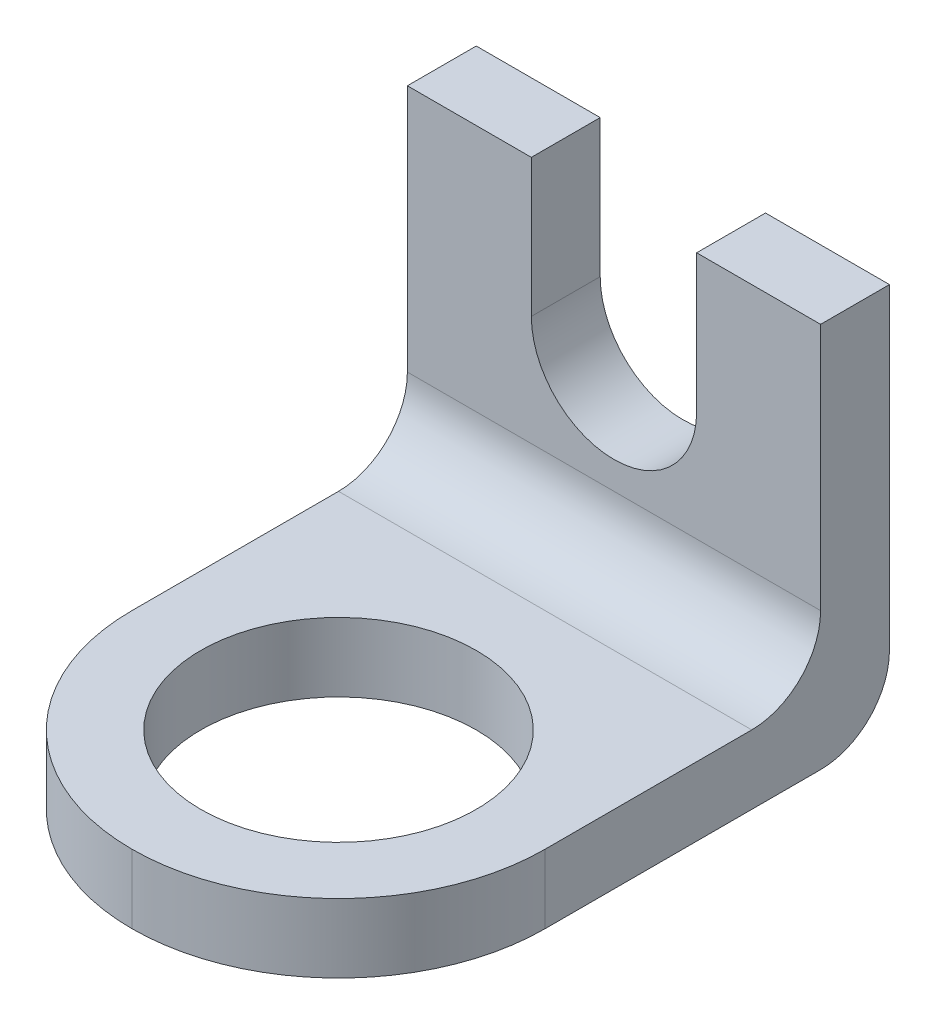
ISO-10303-21;
HEADER;
FILE_DESCRIPTION(('STEP AP214'),'2;1');
FILE_NAME('part.step','',(''),(''),'','','');
FILE_SCHEMA(('AUTOMOTIVE_DESIGN { 1 0 10303 214 1 1 1 1 }'));
ENDSEC;
DATA;
#1=APPLICATION_CONTEXT('core data for automotive mechanical design processes');
#2=APPLICATION_PROTOCOL_DEFINITION('international standard','automotive_design',2000,#1);
#3=PRODUCT_CONTEXT('',#1,'mechanical');
#4=PRODUCT('Part','Part','',(#3));
#5=PRODUCT_RELATED_PRODUCT_CATEGORY('part','',(#4));
#6=PRODUCT_DEFINITION_FORMATION('','',#4);
#7=PRODUCT_DEFINITION_CONTEXT('part definition',#1,'design');
#8=PRODUCT_DEFINITION('design','',#6,#7);
#9=PRODUCT_DEFINITION_SHAPE('','',#8);
#10=(LENGTH_UNIT() NAMED_UNIT(*) SI_UNIT(.MILLI.,.METRE.));
#11=(NAMED_UNIT(*) PLANE_ANGLE_UNIT() SI_UNIT($,.RADIAN.));
#12=(NAMED_UNIT(*) SI_UNIT($,.STERADIAN.) SOLID_ANGLE_UNIT());
#13=UNCERTAINTY_MEASURE_WITH_UNIT(LENGTH_MEASURE(1.E-05),#10,'distance_accuracy_value','');
#14=(GEOMETRIC_REPRESENTATION_CONTEXT(3) GLOBAL_UNCERTAINTY_ASSIGNED_CONTEXT((#13)) GLOBAL_UNIT_ASSIGNED_CONTEXT((#10,
#11,#12)) REPRESENTATION_CONTEXT('',''));
#15=CARTESIAN_POINT('',(0.,0.,0.));
#16=DIRECTION('',(0.,0.,1.));
#17=DIRECTION('',(1.,0.,0.));
#18=AXIS2_PLACEMENT_3D('',#15,#16,#17);
#19=CARTESIAN_POINT('',(0.,-14.,25.));
#20=DIRECTION('',(0.,1.,0.));
#21=DIRECTION('',(0.,0.,1.));
#22=AXIS2_PLACEMENT_3D('',#19,#20,#21);
#23=CYLINDRICAL_SURFACE('',#22,15.);
#24=DIRECTION('',(0.,1.,0.));
#25=VECTOR('',#24,1.);
#26=CARTESIAN_POINT('',(-15.,-14.,25.));
#27=LINE('',#26,#25);
#28=CARTESIAN_POINT('',(-15.,-14.,25.));
#29=VERTEX_POINT('',#28);
#30=CARTESIAN_POINT('',(-15.,-9.,25.));
#31=VERTEX_POINT('',#30);
#32=EDGE_CURVE('E249',#29,#31,#27,.T.);
#33=ORIENTED_EDGE('',*,*,#32,.F.);
#34=CARTESIAN_POINT('',(0.,-14.,25.));
#35=DIRECTION('',(0.,1.,0.));
#36=DIRECTION('',(0.,0.,1.));
#37=AXIS2_PLACEMENT_3D('',#34,#35,#36);
#38=CIRCLE('',#37,15.);
#39=CARTESIAN_POINT('',(0.,-14.,40.));
#40=VERTEX_POINT('',#39);
#41=EDGE_CURVE('E252',#40,#29,#38,.F.);
#42=ORIENTED_EDGE('',*,*,#41,.F.);
#43=DIRECTION('',(0.,-1.,0.));
#44=VECTOR('',#43,1.);
#45=CARTESIAN_POINT('',(0.,0.,40.));
#46=LINE('',#45,#44);
#47=CARTESIAN_POINT('',(0.,-9.,40.));
#48=VERTEX_POINT('',#47);
#49=EDGE_CURVE('E241',#40,#48,#46,.F.);
#50=ORIENTED_EDGE('',*,*,#49,.T.);
#51=CARTESIAN_POINT('',(0.,-9.,25.));
#52=DIRECTION('',(0.,-1.,0.));
#53=DIRECTION('',(0.,0.,-1.));
#54=AXIS2_PLACEMENT_3D('',#51,#52,#53);
#55=CIRCLE('',#54,15.);
#56=EDGE_CURVE('E254',#31,#48,#55,.F.);
#57=ORIENTED_EDGE('',*,*,#56,.F.);
#58=EDGE_LOOP('',(#33,#42,#50,#57));
#59=FACE_BOUND('',#58,.T.);
#60=ADVANCED_FACE('F41',(#59),#23,.T.);
#61=CARTESIAN_POINT('',(0.,-14.,25.));
#62=DIRECTION('',(0.,-1.,0.));
#63=DIRECTION('',(0.,0.,-1.));
#64=AXIS2_PLACEMENT_3D('',#61,#62,#63);
#65=CYLINDRICAL_SURFACE('',#64,15.);
#66=DIRECTION('',(0.,-1.,0.));
#67=VECTOR('',#66,1.);
#68=CARTESIAN_POINT('',(15.,-14.,25.));
#69=LINE('',#68,#67);
#70=CARTESIAN_POINT('',(15.,-9.,25.));
#71=VERTEX_POINT('',#70);
#72=CARTESIAN_POINT('',(15.,-14.,25.));
#73=VERTEX_POINT('',#72);
#74=EDGE_CURVE('E238',#71,#73,#69,.T.);
#75=ORIENTED_EDGE('',*,*,#74,.F.);
#76=CARTESIAN_POINT('',(0.,-9.,25.));
#77=DIRECTION('',(0.,-1.,0.));
#78=DIRECTION('',(0.,0.,-1.));
#79=AXIS2_PLACEMENT_3D('',#76,#77,#78);
#80=CIRCLE('',#79,15.);
#81=EDGE_CURVE('E244',#48,#71,#80,.F.);
#82=ORIENTED_EDGE('',*,*,#81,.F.);
#83=ORIENTED_EDGE('',*,*,#49,.F.);
#84=CARTESIAN_POINT('',(0.,-14.,25.));
#85=DIRECTION('',(0.,1.,0.));
#86=DIRECTION('',(0.,0.,1.));
#87=AXIS2_PLACEMENT_3D('',#84,#85,#86);
#88=CIRCLE('',#87,15.);
#89=EDGE_CURVE('E246',#73,#40,#88,.F.);
#90=ORIENTED_EDGE('',*,*,#89,.F.);
#91=EDGE_LOOP('',(#75,#82,#83,#90));
#92=FACE_BOUND('',#91,.T.);
#93=ADVANCED_FACE('F293',(#92),#65,.T.);
#94=CARTESIAN_POINT('',(-15.,-9.,5.));
#95=DIRECTION('',(-1.,0.,0.));
#96=DIRECTION('',(0.,0.,1.));
#97=AXIS2_PLACEMENT_3D('',#94,#95,#96);
#98=CYLINDRICAL_SURFACE('',#97,5.);
#99=DIRECTION('',(1.,0.,0.));
#100=VECTOR('',#99,1.);
#101=CARTESIAN_POINT('',(-15.,-14.,5.));
#102=LINE('',#101,#100);
#103=CARTESIAN_POINT('',(-15.,-14.,5.));
#104=VERTEX_POINT('',#103);
#105=CARTESIAN_POINT('',(15.,-14.,5.));
#106=VERTEX_POINT('',#105);
#107=EDGE_CURVE('E227',#104,#106,#102,.T.);
#108=ORIENTED_EDGE('',*,*,#107,.F.);
#109=CARTESIAN_POINT('',(-15.,-9.,5.));
#110=DIRECTION('',(1.,0.,0.));
#111=DIRECTION('',(0.,0.,-1.));
#112=AXIS2_PLACEMENT_3D('',#109,#110,#111);
#113=CIRCLE('',#112,5.);
#114=CARTESIAN_POINT('',(-15.,-9.,0.));
#115=VERTEX_POINT('',#114);
#116=EDGE_CURVE('E233',#115,#104,#113,.F.);
#117=ORIENTED_EDGE('',*,*,#116,.F.);
#118=DIRECTION('',(1.,0.,0.));
#119=VECTOR('',#118,1.);
#120=CARTESIAN_POINT('',(-15.,-9.,0.));
#121=LINE('',#120,#119);
#122=CARTESIAN_POINT('',(15.,-9.,0.));
#123=VERTEX_POINT('',#122);
#124=EDGE_CURVE('E230',#123,#115,#121,.F.);
#125=ORIENTED_EDGE('',*,*,#124,.F.);
#126=CARTESIAN_POINT('',(15.,-9.,5.));
#127=DIRECTION('',(-1.,0.,0.));
#128=DIRECTION('',(0.,0.,1.));
#129=AXIS2_PLACEMENT_3D('',#126,#127,#128);
#130=CIRCLE('',#129,5.);
#131=EDGE_CURVE('E236',#106,#123,#130,.F.);
#132=ORIENTED_EDGE('',*,*,#131,.F.);
#133=EDGE_LOOP('',(#108,#117,#125,#132));
#134=FACE_BOUND('',#133,.T.);
#135=ADVANCED_FACE('F298',(#134),#98,.T.);
#136=CARTESIAN_POINT('',(0.,0.,5.));
#137=DIRECTION('',(0.,0.,-1.));
#138=DIRECTION('',(-1.,0.,0.));
#139=AXIS2_PLACEMENT_3D('',#136,#137,#138);
#140=PLANE('',#139);
#141=DIRECTION('',(0.,-1.,0.));
#142=VECTOR('',#141,1.);
#143=CARTESIAN_POINT('',(-15.,-14.,5.));
#144=LINE('',#143,#142);
#145=CARTESIAN_POINT('',(-15.,14.,5.));
#146=VERTEX_POINT('',#145);
#147=CARTESIAN_POINT('',(-15.,-4.,5.));
#148=VERTEX_POINT('',#147);
#149=EDGE_CURVE('E203',#146,#148,#144,.T.);
#150=ORIENTED_EDGE('',*,*,#149,.T.);
#151=DIRECTION('',(-1.,0.,0.));
#152=VECTOR('',#151,1.);
#153=CARTESIAN_POINT('',(15.,-4.,5.));
#154=LINE('',#153,#152);
#155=CARTESIAN_POINT('',(15.,-4.,5.));
#156=VERTEX_POINT('',#155);
#157=EDGE_CURVE('E68',#148,#156,#154,.F.);
#158=ORIENTED_EDGE('',*,*,#157,.T.);
#159=DIRECTION('',(0.,1.,0.));
#160=VECTOR('',#159,1.);
#161=CARTESIAN_POINT('',(15.,-14.,5.));
#162=LINE('',#161,#160);
#163=CARTESIAN_POINT('',(15.,14.,5.));
#164=VERTEX_POINT('',#163);
#165=EDGE_CURVE('E195',#156,#164,#162,.T.);
#166=ORIENTED_EDGE('',*,*,#165,.T.);
#167=DIRECTION('',(-1.,0.,0.));
#168=VECTOR('',#167,1.);
#169=CARTESIAN_POINT('',(-15.,14.,5.));
#170=LINE('',#169,#168);
#171=CARTESIAN_POINT('',(6.,14.,5.));
#172=VERTEX_POINT('',#171);
#173=EDGE_CURVE('E199',#164,#172,#170,.T.);
#174=ORIENTED_EDGE('',*,*,#173,.T.);
#175=DIRECTION('',(0.,1.,0.));
#176=VECTOR('',#175,1.);
#177=CARTESIAN_POINT('',(6.,14.,5.));
#178=LINE('',#177,#176);
#179=CARTESIAN_POINT('',(6.,4.,5.));
#180=VERTEX_POINT('',#179);
#181=EDGE_CURVE('E177',#180,#172,#178,.T.);
#182=ORIENTED_EDGE('',*,*,#181,.F.);
#183=CARTESIAN_POINT('',(0.,4.,5.));
#184=DIRECTION('',(0.,0.,1.));
#185=DIRECTION('',(1.,0.,0.));
#186=AXIS2_PLACEMENT_3D('',#183,#184,#185);
#187=CIRCLE('',#186,6.);
#188=CARTESIAN_POINT('',(-6.,4.,5.));
#189=VERTEX_POINT('',#188);
#190=EDGE_CURVE('E179',#189,#180,#187,.T.);
#191=ORIENTED_EDGE('',*,*,#190,.F.);
#192=DIRECTION('',(0.,-1.,0.));
#193=VECTOR('',#192,1.);
#194=CARTESIAN_POINT('',(-6.,14.,5.));
#195=LINE('',#194,#193);
#196=CARTESIAN_POINT('',(-6.,14.,5.));
#197=VERTEX_POINT('',#196);
#198=EDGE_CURVE('E158',#197,#189,#195,.T.);
#199=ORIENTED_EDGE('',*,*,#198,.F.);
#200=EDGE_CURVE('E197',#197,#146,#170,.T.);
#201=ORIENTED_EDGE('',*,*,#200,.T.);
#202=EDGE_LOOP('',(#150,#158,#166,#174,#182,#191,#199,#201));
#203=FACE_BOUND('',#202,.T.);
#204=ADVANCED_FACE('F304',(#203),#140,.F.);
#205=CARTESIAN_POINT('',(-15.,14.,5.));
#206=DIRECTION('',(0.,-1.,0.));
#207=DIRECTION('',(0.,0.,-1.));
#208=AXIS2_PLACEMENT_3D('',#205,#206,#207);
#209=PLANE('',#208);
#210=ORIENTED_EDGE('',*,*,#200,.F.);
#211=DIRECTION('',(0.,0.,1.));
#212=VECTOR('',#211,1.);
#213=CARTESIAN_POINT('',(-6.,14.,0.));
#214=LINE('',#213,#212);
#215=CARTESIAN_POINT('',(-6.,14.,0.));
#216=VERTEX_POINT('',#215);
#217=EDGE_CURVE('E188',#216,#197,#214,.T.);
#218=ORIENTED_EDGE('',*,*,#217,.F.);
#219=DIRECTION('',(-1.,0.,0.));
#220=VECTOR('',#219,1.);
#221=CARTESIAN_POINT('',(-15.,14.,0.));
#222=LINE('',#221,#220);
#223=CARTESIAN_POINT('',(-15.,14.,0.));
#224=VERTEX_POINT('',#223);
#225=EDGE_CURVE('E176',#216,#224,#222,.T.);
#226=ORIENTED_EDGE('',*,*,#225,.T.);
#227=DIRECTION('',(0.,0.,-1.));
#228=VECTOR('',#227,1.);
#229=CARTESIAN_POINT('',(-15.,14.,5.));
#230=LINE('',#229,#228);
#231=EDGE_CURVE('E221',#146,#224,#230,.T.);
#232=ORIENTED_EDGE('',*,*,#231,.F.);
#233=EDGE_LOOP('',(#210,#218,#226,#232));
#234=FACE_BOUND('',#233,.T.);
#235=ADVANCED_FACE('F310',(#234),#209,.F.);
#236=CARTESIAN_POINT('',(15.,-14.,5.));
#237=DIRECTION('',(-1.,0.,0.));
#238=DIRECTION('',(0.,0.,1.));
#239=AXIS2_PLACEMENT_3D('',#236,#237,#238);
#240=PLANE('',#239);
#241=DIRECTION('',(0.,0.,-1.));
#242=VECTOR('',#241,1.);
#243=CARTESIAN_POINT('',(15.,-9.,40.));
#244=LINE('',#243,#242);
#245=CARTESIAN_POINT('',(15.,-9.,10.));
#246=VERTEX_POINT('',#245);
#247=EDGE_CURVE('E182',#71,#246,#244,.T.);
#248=ORIENTED_EDGE('',*,*,#247,.F.);
#249=ORIENTED_EDGE('',*,*,#74,.T.);
#250=DIRECTION('',(0.,0.,-1.));
#251=VECTOR('',#250,1.);
#252=CARTESIAN_POINT('',(15.,-14.,5.));
#253=LINE('',#252,#251);
#254=EDGE_CURVE('E217',#73,#106,#253,.T.);
#255=ORIENTED_EDGE('',*,*,#254,.T.);
#256=ORIENTED_EDGE('',*,*,#131,.T.);
#257=DIRECTION('',(0.,1.,0.));
#258=VECTOR('',#257,1.);
#259=CARTESIAN_POINT('',(15.,-14.,0.));
#260=LINE('',#259,#258);
#261=CARTESIAN_POINT('',(15.,14.,0.));
#262=VERTEX_POINT('',#261);
#263=EDGE_CURVE('E190',#123,#262,#260,.T.);
#264=ORIENTED_EDGE('',*,*,#263,.T.);
#265=DIRECTION('',(0.,0.,-1.));
#266=VECTOR('',#265,1.);
#267=CARTESIAN_POINT('',(15.,14.,5.));
#268=LINE('',#267,#266);
#269=EDGE_CURVE('E224',#164,#262,#268,.T.);
#270=ORIENTED_EDGE('',*,*,#269,.F.);
#271=ORIENTED_EDGE('',*,*,#165,.F.);
#272=CARTESIAN_POINT('',(15.,-4.,10.));
#273=DIRECTION('',(-1.,0.,0.));
#274=DIRECTION('',(0.,0.,1.));
#275=AXIS2_PLACEMENT_3D('',#272,#273,#274);
#276=CIRCLE('',#275,5.);
#277=EDGE_CURVE('E12',#156,#246,#276,.T.);
#278=ORIENTED_EDGE('',*,*,#277,.T.);
#279=EDGE_LOOP('',(#248,#249,#255,#256,#264,#270,#271,#278));
#280=FACE_BOUND('',#279,.T.);
#281=ADVANCED_FACE('F306',(#280),#240,.F.);
#282=CARTESIAN_POINT('',(6.,14.,0.));
#283=VERTEX_POINT('',#282);
#284=EDGE_CURVE('E211',#262,#283,#222,.T.);
#285=ORIENTED_EDGE('',*,*,#284,.T.);
#286=DIRECTION('',(0.,0.,1.));
#287=VECTOR('',#286,1.);
#288=CARTESIAN_POINT('',(6.,14.,0.));
#289=LINE('',#288,#287);
#290=EDGE_CURVE('E191',#283,#172,#289,.T.);
#291=ORIENTED_EDGE('',*,*,#290,.T.);
#292=ORIENTED_EDGE('',*,*,#173,.F.);
#293=ORIENTED_EDGE('',*,*,#269,.T.);
#294=EDGE_LOOP('',(#285,#291,#292,#293));
#295=FACE_BOUND('',#294,.T.);
#296=ADVANCED_FACE('F309',(#295),#209,.F.);
#297=CARTESIAN_POINT('',(-15.,-14.,5.));
#298=DIRECTION('',(1.,0.,0.));
#299=DIRECTION('',(0.,0.,-1.));
#300=AXIS2_PLACEMENT_3D('',#297,#298,#299);
#301=PLANE('',#300);
#302=DIRECTION('',(0.,0.,-1.));
#303=VECTOR('',#302,1.);
#304=CARTESIAN_POINT('',(-15.,-14.,5.));
#305=LINE('',#304,#303);
#306=EDGE_CURVE('E219',#29,#104,#305,.T.);
#307=ORIENTED_EDGE('',*,*,#306,.F.);
#308=ORIENTED_EDGE('',*,*,#32,.T.);
#309=DIRECTION('',(0.,0.,-1.));
#310=VECTOR('',#309,1.);
#311=CARTESIAN_POINT('',(-15.,-9.,40.));
#312=LINE('',#311,#310);
#313=CARTESIAN_POINT('',(-15.,-9.,10.));
#314=VERTEX_POINT('',#313);
#315=EDGE_CURVE('E264',#31,#314,#312,.T.);
#316=ORIENTED_EDGE('',*,*,#315,.T.);
#317=CARTESIAN_POINT('',(-15.,-4.,10.));
#318=DIRECTION('',(1.,0.,0.));
#319=DIRECTION('',(0.,0.,-1.));
#320=AXIS2_PLACEMENT_3D('',#317,#318,#319);
#321=CIRCLE('',#320,5.);
#322=EDGE_CURVE('E49',#314,#148,#321,.T.);
#323=ORIENTED_EDGE('',*,*,#322,.T.);
#324=ORIENTED_EDGE('',*,*,#149,.F.);
#325=ORIENTED_EDGE('',*,*,#231,.T.);
#326=DIRECTION('',(0.,-1.,0.));
#327=VECTOR('',#326,1.);
#328=CARTESIAN_POINT('',(-15.,-14.,0.));
#329=LINE('',#328,#327);
#330=EDGE_CURVE('E198',#224,#115,#329,.T.);
#331=ORIENTED_EDGE('',*,*,#330,.T.);
#332=ORIENTED_EDGE('',*,*,#116,.T.);
#333=EDGE_LOOP('',(#307,#308,#316,#323,#324,#325,#331,#332));
#334=FACE_BOUND('',#333,.T.);
#335=ADVANCED_FACE('F269',(#334),#301,.F.);
#336=CARTESIAN_POINT('',(-15.,-14.,5.));
#337=DIRECTION('',(0.,1.,0.));
#338=DIRECTION('',(0.,0.,1.));
#339=AXIS2_PLACEMENT_3D('',#336,#337,#338);
#340=PLANE('',#339);
#341=CARTESIAN_POINT('',(0.,-14.,25.));
#342=DIRECTION('',(0.,1.,0.));
#343=DIRECTION('',(0.,0.,1.));
#344=AXIS2_PLACEMENT_3D('',#341,#342,#343);
#345=CIRCLE('',#344,10.);
#346=CARTESIAN_POINT('',(0.,-14.,35.));
#347=VERTEX_POINT('',#346);
#348=EDGE_CURVE('E271',#347,#347,#345,.T.);
#349=ORIENTED_EDGE('',*,*,#348,.T.);
#350=EDGE_LOOP('',(#349));
#351=FACE_BOUND('',#350,.T.);
#352=ORIENTED_EDGE('',*,*,#89,.T.);
#353=ORIENTED_EDGE('',*,*,#41,.T.);
#354=ORIENTED_EDGE('',*,*,#306,.T.);
#355=ORIENTED_EDGE('',*,*,#107,.T.);
#356=ORIENTED_EDGE('',*,*,#254,.F.);
#357=EDGE_LOOP('',(#352,#353,#354,#355,#356));
#358=FACE_BOUND('',#357,.T.);
#359=ADVANCED_FACE('F317',(#351,#358),#340,.F.);
#360=CARTESIAN_POINT('',(0.,0.,0.));
#361=DIRECTION('',(0.,0.,-1.));
#362=DIRECTION('',(-1.,0.,0.));
#363=AXIS2_PLACEMENT_3D('',#360,#361,#362);
#364=PLANE('',#363);
#365=ORIENTED_EDGE('',*,*,#263,.F.);
#366=ORIENTED_EDGE('',*,*,#124,.T.);
#367=ORIENTED_EDGE('',*,*,#330,.F.);
#368=ORIENTED_EDGE('',*,*,#225,.F.);
#369=DIRECTION('',(0.,-1.,0.));
#370=VECTOR('',#369,1.);
#371=CARTESIAN_POINT('',(-6.,14.,0.));
#372=LINE('',#371,#370);
#373=CARTESIAN_POINT('',(-6.,4.,0.));
#374=VERTEX_POINT('',#373);
#375=EDGE_CURVE('E155',#216,#374,#372,.T.);
#376=ORIENTED_EDGE('',*,*,#375,.T.);
#377=CARTESIAN_POINT('',(0.,4.,0.));
#378=DIRECTION('',(0.,0.,1.));
#379=DIRECTION('',(1.,0.,0.));
#380=AXIS2_PLACEMENT_3D('',#377,#378,#379);
#381=CIRCLE('',#380,6.);
#382=CARTESIAN_POINT('',(6.,4.,0.));
#383=VERTEX_POINT('',#382);
#384=EDGE_CURVE('E167',#374,#383,#381,.T.);
#385=ORIENTED_EDGE('',*,*,#384,.T.);
#386=DIRECTION('',(0.,1.,0.));
#387=VECTOR('',#386,1.);
#388=CARTESIAN_POINT('',(6.,14.,0.));
#389=LINE('',#388,#387);
#390=EDGE_CURVE('E163',#383,#283,#389,.T.);
#391=ORIENTED_EDGE('',*,*,#390,.T.);
#392=ORIENTED_EDGE('',*,*,#284,.F.);
#393=EDGE_LOOP('',(#365,#366,#367,#368,#376,#385,#391,#392));
#394=FACE_BOUND('',#393,.T.);
#395=ADVANCED_FACE('F174',(#394),#364,.T.);
#396=CARTESIAN_POINT('',(-6.,14.,0.));
#397=DIRECTION('',(-1.,0.,0.));
#398=DIRECTION('',(0.,-1.,0.));
#399=AXIS2_PLACEMENT_3D('',#396,#397,#398);
#400=PLANE('',#399);
#401=ORIENTED_EDGE('',*,*,#198,.T.);
#402=DIRECTION('',(0.,0.,1.));
#403=VECTOR('',#402,1.);
#404=CARTESIAN_POINT('',(-6.,4.,0.));
#405=LINE('',#404,#403);
#406=EDGE_CURVE('E151',#374,#189,#405,.T.);
#407=ORIENTED_EDGE('',*,*,#406,.F.);
#408=ORIENTED_EDGE('',*,*,#375,.F.);
#409=ORIENTED_EDGE('',*,*,#217,.T.);
#410=EDGE_LOOP('',(#401,#407,#408,#409));
#411=FACE_BOUND('',#410,.T.);
#412=ADVANCED_FACE('F153',(#411),#400,.F.);
#413=CARTESIAN_POINT('',(6.,14.,0.));
#414=DIRECTION('',(1.,0.,0.));
#415=DIRECTION('',(0.,1.,0.));
#416=AXIS2_PLACEMENT_3D('',#413,#414,#415);
#417=PLANE('',#416);
#418=ORIENTED_EDGE('',*,*,#181,.T.);
#419=ORIENTED_EDGE('',*,*,#290,.F.);
#420=ORIENTED_EDGE('',*,*,#390,.F.);
#421=DIRECTION('',(0.,0.,1.));
#422=VECTOR('',#421,1.);
#423=CARTESIAN_POINT('',(6.,4.,0.));
#424=LINE('',#423,#422);
#425=EDGE_CURVE('E162',#383,#180,#424,.T.);
#426=ORIENTED_EDGE('',*,*,#425,.T.);
#427=EDGE_LOOP('',(#418,#419,#420,#426));
#428=FACE_BOUND('',#427,.T.);
#429=ADVANCED_FACE('F289',(#428),#417,.F.);
#430=CARTESIAN_POINT('',(0.,4.,0.));
#431=DIRECTION('',(0.,0.,1.));
#432=DIRECTION('',(1.,0.,0.));
#433=AXIS2_PLACEMENT_3D('',#430,#431,#432);
#434=CYLINDRICAL_SURFACE('',#433,6.);
#435=ORIENTED_EDGE('',*,*,#190,.T.);
#436=ORIENTED_EDGE('',*,*,#425,.F.);
#437=ORIENTED_EDGE('',*,*,#384,.F.);
#438=ORIENTED_EDGE('',*,*,#406,.T.);
#439=EDGE_LOOP('',(#435,#436,#437,#438));
#440=FACE_BOUND('',#439,.T.);
#441=ADVANCED_FACE('F168',(#440),#434,.F.);
#442=CARTESIAN_POINT('',(-15.,-9.,40.));
#443=DIRECTION('',(0.,-1.,0.));
#444=DIRECTION('',(0.,0.,-1.));
#445=AXIS2_PLACEMENT_3D('',#442,#443,#444);
#446=PLANE('',#445);
#447=CARTESIAN_POINT('',(0.,-9.,25.));
#448=DIRECTION('',(0.,1.,0.));
#449=DIRECTION('',(0.,0.,1.));
#450=AXIS2_PLACEMENT_3D('',#447,#448,#449);
#451=CIRCLE('',#450,10.);
#452=CARTESIAN_POINT('',(0.,-9.,35.));
#453=VERTEX_POINT('',#452);
#454=EDGE_CURVE('E273',#453,#453,#451,.T.);
#455=ORIENTED_EDGE('',*,*,#454,.F.);
#456=EDGE_LOOP('',(#455));
#457=FACE_BOUND('',#456,.T.);
#458=ORIENTED_EDGE('',*,*,#247,.T.);
#459=DIRECTION('',(-1.,0.,0.));
#460=VECTOR('',#459,1.);
#461=CARTESIAN_POINT('',(-15.,-9.,10.));
#462=LINE('',#461,#460);
#463=EDGE_CURVE('E256',#246,#314,#462,.T.);
#464=ORIENTED_EDGE('',*,*,#463,.T.);
#465=ORIENTED_EDGE('',*,*,#315,.F.);
#466=ORIENTED_EDGE('',*,*,#56,.T.);
#467=ORIENTED_EDGE('',*,*,#81,.T.);
#468=EDGE_LOOP('',(#458,#464,#465,#466,#467));
#469=FACE_BOUND('',#468,.T.);
#470=ADVANCED_FACE('F263',(#457,#469),#446,.F.);
#471=CARTESIAN_POINT('',(0.,-14.,25.));
#472=DIRECTION('',(0.,1.,0.));
#473=DIRECTION('',(0.,0.,1.));
#474=AXIS2_PLACEMENT_3D('',#471,#472,#473);
#475=CYLINDRICAL_SURFACE('',#474,10.);
#476=ORIENTED_EDGE('',*,*,#348,.F.);
#477=EDGE_LOOP('',(#476));
#478=FACE_BOUND('',#477,.T.);
#479=ORIENTED_EDGE('',*,*,#454,.T.);
#480=EDGE_LOOP('',(#479));
#481=FACE_BOUND('',#480,.T.);
#482=ADVANCED_FACE('F279',(#478,#481),#475,.F.);
#483=CARTESIAN_POINT('',(-15.,-4.,10.));
#484=DIRECTION('',(1.,0.,0.));
#485=DIRECTION('',(0.,0.,-1.));
#486=AXIS2_PLACEMENT_3D('',#483,#484,#485);
#487=CYLINDRICAL_SURFACE('',#486,5.);
#488=ORIENTED_EDGE('',*,*,#277,.F.);
#489=ORIENTED_EDGE('',*,*,#157,.F.);
#490=ORIENTED_EDGE('',*,*,#322,.F.);
#491=ORIENTED_EDGE('',*,*,#463,.F.);
#492=EDGE_LOOP('',(#488,#489,#490,#491));
#493=FACE_BOUND('',#492,.T.);
#494=ADVANCED_FACE('F43',(#493),#487,.F.);
#495=CLOSED_SHELL('',(#60,#93,#135,#204,#235,#281,#296,#335,#359,#395,#412,#429,#441,#470,#482,#494));
#496=MANIFOLD_SOLID_BREP('B2',#495);
#497=ADVANCED_BREP_SHAPE_REPRESENTATION('',(#18,#496),#14);
#498=SHAPE_DEFINITION_REPRESENTATION(#9,#497);
ENDSEC;
END-ISO-10303-21;
